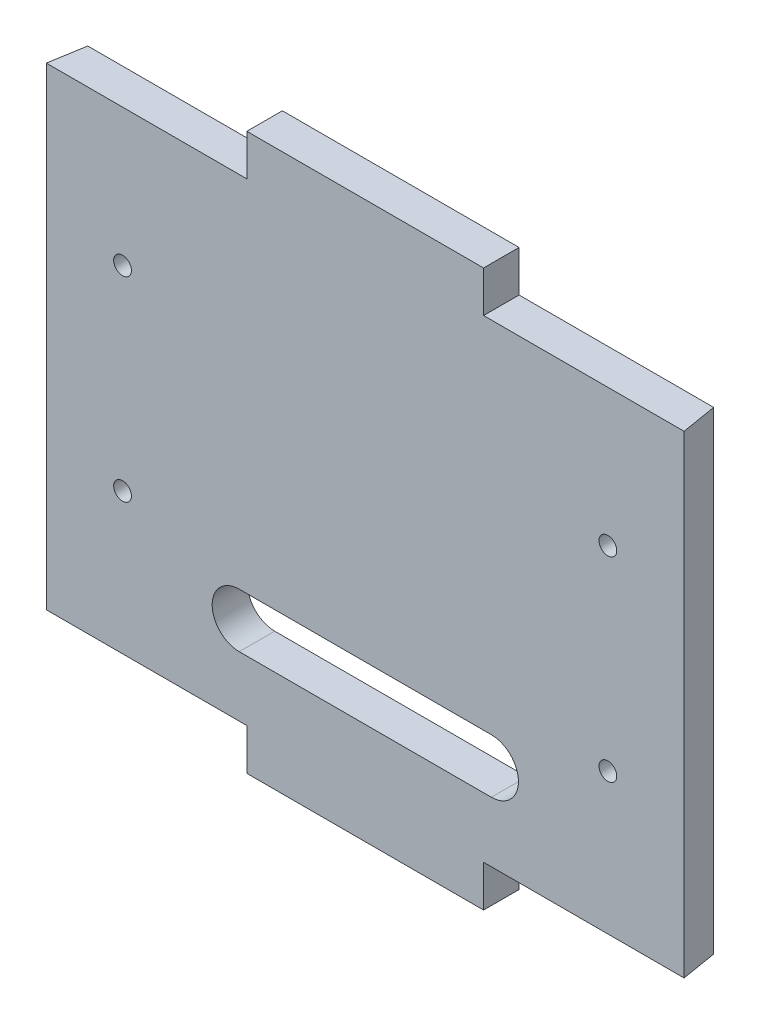
ISO-10303-21;
HEADER;
FILE_DESCRIPTION(('STEP AP214'),'2;1');
FILE_NAME('part.step','',(''),(''),'','','');
FILE_SCHEMA(('AUTOMOTIVE_DESIGN { 1 0 10303 214 1 1 1 1 }'));
ENDSEC;
DATA;
#1=APPLICATION_CONTEXT('core data for automotive mechanical design processes');
#2=APPLICATION_PROTOCOL_DEFINITION('international standard','automotive_design',2000,#1);
#3=PRODUCT_CONTEXT('',#1,'mechanical');
#4=PRODUCT('Part','Part','',(#3));
#5=PRODUCT_RELATED_PRODUCT_CATEGORY('part','',(#4));
#6=PRODUCT_DEFINITION_FORMATION('','',#4);
#7=PRODUCT_DEFINITION_CONTEXT('part definition',#1,'design');
#8=PRODUCT_DEFINITION('design','',#6,#7);
#9=PRODUCT_DEFINITION_SHAPE('','',#8);
#10=(LENGTH_UNIT() NAMED_UNIT(*) SI_UNIT(.MILLI.,.METRE.));
#11=(NAMED_UNIT(*) PLANE_ANGLE_UNIT() SI_UNIT($,.RADIAN.));
#12=(NAMED_UNIT(*) SI_UNIT($,.STERADIAN.) SOLID_ANGLE_UNIT());
#13=UNCERTAINTY_MEASURE_WITH_UNIT(LENGTH_MEASURE(1.E-05),#10,'distance_accuracy_value','');
#14=(GEOMETRIC_REPRESENTATION_CONTEXT(3) GLOBAL_UNCERTAINTY_ASSIGNED_CONTEXT((#13)) GLOBAL_UNIT_ASSIGNED_CONTEXT((#10,
#11,#12)) REPRESENTATION_CONTEXT('',''));
#15=CARTESIAN_POINT('',(0.,0.,0.));
#16=DIRECTION('',(0.,0.,1.));
#17=DIRECTION('',(1.,0.,0.));
#18=AXIS2_PLACEMENT_3D('',#15,#16,#17);
#19=CARTESIAN_POINT('',(33.2768883955837,10.8027095474567,3.));
#20=DIRECTION('',(0.,-1.,0.));
#21=DIRECTION('',(0.,0.,-1.));
#22=AXIS2_PLACEMENT_3D('',#19,#20,#21);
#23=PLANE('',#22);
#24=DIRECTION('',(-0.164398987305357,0.,0.986393923832144));
#25=VECTOR('',#24,1.);
#26=CARTESIAN_POINT('',(16.7948497787383,10.8027095474567,0.252993563859098));
#27=LINE('',#26,#25);
#28=CARTESIAN_POINT('',(16.8370153727148,10.8027095474567,0.));
#29=VERTEX_POINT('',#28);
#30=CARTESIAN_POINT('',(16.3370153727148,10.8027095474567,3.));
#31=VERTEX_POINT('',#30);
#32=EDGE_CURVE('E205',#29,#31,#27,.T.);
#33=ORIENTED_EDGE('',*,*,#32,.F.);
#34=DIRECTION('',(-1.,0.,0.));
#35=VECTOR('',#34,1.);
#36=CARTESIAN_POINT('',(33.2768883955837,10.8027095474567,0.));
#37=LINE('',#36,#35);
#38=CARTESIAN_POINT('',(33.2768883955837,10.8027095474567,0.));
#39=VERTEX_POINT('',#38);
#40=EDGE_CURVE('E247',#39,#29,#37,.T.);
#41=ORIENTED_EDGE('',*,*,#40,.F.);
#42=DIRECTION('',(0.,0.,-1.));
#43=VECTOR('',#42,1.);
#44=CARTESIAN_POINT('',(33.2768883955837,10.8027095474567,3.));
#45=LINE('',#44,#43);
#46=CARTESIAN_POINT('',(33.2768883955837,10.8027095474567,3.));
#47=VERTEX_POINT('',#46);
#48=EDGE_CURVE('E310',#47,#39,#45,.T.);
#49=ORIENTED_EDGE('',*,*,#48,.F.);
#50=DIRECTION('',(-1.,0.,0.));
#51=VECTOR('',#50,1.);
#52=CARTESIAN_POINT('',(33.2768883955837,10.8027095474567,3.));
#53=LINE('',#52,#51);
#54=EDGE_CURVE('E248',#47,#31,#53,.T.);
#55=ORIENTED_EDGE('',*,*,#54,.T.);
#56=EDGE_LOOP('',(#33,#41,#49,#55));
#57=FACE_BOUND('',#56,.T.);
#58=ADVANCED_FACE('F38',(#57),#23,.T.);
#59=CARTESIAN_POINT('',(33.2768883955837,10.8027095474567,3.));
#60=DIRECTION('',(1.,0.,0.));
#61=DIRECTION('',(0.,0.,-1.));
#62=AXIS2_PLACEMENT_3D('',#59,#60,#61);
#63=PLANE('',#62);
#64=DIRECTION('',(0.,-1.,0.));
#65=VECTOR('',#64,1.);
#66=CARTESIAN_POINT('',(33.2768883955837,10.8027095474567,0.));
#67=LINE('',#66,#65);
#68=CARTESIAN_POINT('',(33.2768883955837,7.30270954745676,0.));
#69=VERTEX_POINT('',#68);
#70=EDGE_CURVE('E253',#39,#69,#67,.T.);
#71=ORIENTED_EDGE('',*,*,#70,.T.);
#72=DIRECTION('',(0.,0.,-1.));
#73=VECTOR('',#72,1.);
#74=CARTESIAN_POINT('',(33.2768883955837,7.30270954745676,3.));
#75=LINE('',#74,#73);
#76=CARTESIAN_POINT('',(33.2768883955837,7.30270954745676,3.));
#77=VERTEX_POINT('',#76);
#78=EDGE_CURVE('E231',#77,#69,#75,.T.);
#79=ORIENTED_EDGE('',*,*,#78,.F.);
#80=DIRECTION('',(0.,-1.,0.));
#81=VECTOR('',#80,1.);
#82=CARTESIAN_POINT('',(33.2768883955837,10.8027095474567,3.));
#83=LINE('',#82,#81);
#84=EDGE_CURVE('E280',#47,#77,#83,.T.);
#85=ORIENTED_EDGE('',*,*,#84,.F.);
#86=ORIENTED_EDGE('',*,*,#48,.T.);
#87=EDGE_LOOP('',(#71,#79,#85,#86));
#88=FACE_BOUND('',#87,.T.);
#89=ADVANCED_FACE('F372',(#88),#63,.F.);
#90=CARTESIAN_POINT('',(53.2768883955837,9.30270954745676,3.));
#91=DIRECTION('',(-1.,0.,0.));
#92=DIRECTION('',(0.,-1.,0.));
#93=AXIS2_PLACEMENT_3D('',#90,#91,#92);
#94=PLANE('',#93);
#95=DIRECTION('',(0.,1.,0.));
#96=VECTOR('',#95,1.);
#97=CARTESIAN_POINT('',(53.2768883955837,9.30270954745676,0.));
#98=LINE('',#97,#96);
#99=CARTESIAN_POINT('',(53.2768883955837,7.30270954745676,0.));
#100=VERTEX_POINT('',#99);
#101=CARTESIAN_POINT('',(53.2768883955837,10.8027095474567,0.));
#102=VERTEX_POINT('',#101);
#103=EDGE_CURVE('E304',#100,#102,#98,.T.);
#104=ORIENTED_EDGE('',*,*,#103,.T.);
#105=DIRECTION('',(0.,0.,-1.));
#106=VECTOR('',#105,1.);
#107=CARTESIAN_POINT('',(53.2768883955837,10.8027095474567,3.));
#108=LINE('',#107,#106);
#109=CARTESIAN_POINT('',(53.2768883955837,10.8027095474567,3.));
#110=VERTEX_POINT('',#109);
#111=EDGE_CURVE('E314',#110,#102,#108,.T.);
#112=ORIENTED_EDGE('',*,*,#111,.F.);
#113=DIRECTION('',(0.,1.,0.));
#114=VECTOR('',#113,1.);
#115=CARTESIAN_POINT('',(53.2768883955837,9.30270954745676,3.));
#116=LINE('',#115,#114);
#117=CARTESIAN_POINT('',(53.2768883955837,7.30270954745676,3.));
#118=VERTEX_POINT('',#117);
#119=EDGE_CURVE('E277',#118,#110,#116,.T.);
#120=ORIENTED_EDGE('',*,*,#119,.F.);
#121=DIRECTION('',(0.,0.,1.));
#122=VECTOR('',#121,1.);
#123=CARTESIAN_POINT('',(53.2768883955837,7.30270954745676,0.));
#124=LINE('',#123,#122);
#125=EDGE_CURVE('E239',#100,#118,#124,.T.);
#126=ORIENTED_EDGE('',*,*,#125,.F.);
#127=EDGE_LOOP('',(#104,#112,#120,#126));
#128=FACE_BOUND('',#127,.T.);
#129=ADVANCED_FACE('F379',(#128),#94,.F.);
#130=CARTESIAN_POINT('',(70.2167614184526,10.8027095474567,3.));
#131=DIRECTION('',(0.,-1.,0.));
#132=DIRECTION('',(0.,0.,-1.));
#133=AXIS2_PLACEMENT_3D('',#130,#131,#132);
#134=PLANE('',#133);
#135=DIRECTION('',(-0.164398987305357,0.,-0.986393923832144));
#136=VECTOR('',#135,1.);
#137=CARTESIAN_POINT('',(70.2167614184526,10.8027095474567,3.));
#138=LINE('',#137,#136);
#139=CARTESIAN_POINT('',(70.2167614184526,10.8027095474567,3.));
#140=VERTEX_POINT('',#139);
#141=CARTESIAN_POINT('',(69.7167614184526,10.8027095474567,0.));
#142=VERTEX_POINT('',#141);
#143=EDGE_CURVE('E212',#140,#142,#138,.T.);
#144=ORIENTED_EDGE('',*,*,#143,.F.);
#145=DIRECTION('',(-1.,0.,0.));
#146=VECTOR('',#145,1.);
#147=CARTESIAN_POINT('',(70.2167614184526,10.8027095474567,3.));
#148=LINE('',#147,#146);
#149=EDGE_CURVE('E273',#140,#110,#148,.T.);
#150=ORIENTED_EDGE('',*,*,#149,.T.);
#151=ORIENTED_EDGE('',*,*,#111,.T.);
#152=DIRECTION('',(-1.,0.,0.));
#153=VECTOR('',#152,1.);
#154=CARTESIAN_POINT('',(70.2167614184526,10.8027095474567,0.));
#155=LINE('',#154,#153);
#156=EDGE_CURVE('E301',#142,#102,#155,.T.);
#157=ORIENTED_EDGE('',*,*,#156,.F.);
#158=EDGE_LOOP('',(#144,#150,#151,#157));
#159=FACE_BOUND('',#158,.T.);
#160=ADVANCED_FACE('F427',(#159),#134,.T.);
#161=CARTESIAN_POINT('',(70.2167614184526,50.8027095474567,3.));
#162=DIRECTION('',(0.,-1.,0.));
#163=DIRECTION('',(0.,0.,-1.));
#164=AXIS2_PLACEMENT_3D('',#161,#162,#163);
#165=PLANE('',#164);
#166=DIRECTION('',(-1.,0.,0.));
#167=VECTOR('',#166,1.);
#168=CARTESIAN_POINT('',(70.2167614184526,50.8027095474567,3.));
#169=LINE('',#168,#167);
#170=CARTESIAN_POINT('',(70.2167614184526,50.8027095474567,3.));
#171=VERTEX_POINT('',#170);
#172=CARTESIAN_POINT('',(53.2768883955837,50.8027095474567,3.));
#173=VERTEX_POINT('',#172);
#174=EDGE_CURVE('E267',#171,#173,#169,.T.);
#175=ORIENTED_EDGE('',*,*,#174,.F.);
#176=DIRECTION('',(0.164398987305357,0.,0.986393923832144));
#177=VECTOR('',#176,1.);
#178=CARTESIAN_POINT('',(69.7167614184526,50.8027095474567,0.));
#179=LINE('',#178,#177);
#180=CARTESIAN_POINT('',(69.7167614184526,50.8027095474567,0.));
#181=VERTEX_POINT('',#180);
#182=EDGE_CURVE('E202',#181,#171,#179,.T.);
#183=ORIENTED_EDGE('',*,*,#182,.F.);
#184=DIRECTION('',(-1.,0.,0.));
#185=VECTOR('',#184,1.);
#186=CARTESIAN_POINT('',(70.2167614184526,50.8027095474567,0.));
#187=LINE('',#186,#185);
#188=CARTESIAN_POINT('',(53.2768883955837,50.8027095474567,0.));
#189=VERTEX_POINT('',#188);
#190=EDGE_CURVE('E298',#181,#189,#187,.T.);
#191=ORIENTED_EDGE('',*,*,#190,.T.);
#192=DIRECTION('',(0.,0.,-1.));
#193=VECTOR('',#192,1.);
#194=CARTESIAN_POINT('',(53.2768883955837,50.8027095474567,3.));
#195=LINE('',#194,#193);
#196=EDGE_CURVE('E318',#173,#189,#195,.T.);
#197=ORIENTED_EDGE('',*,*,#196,.F.);
#198=EDGE_LOOP('',(#175,#183,#191,#197));
#199=FACE_BOUND('',#198,.T.);
#200=ADVANCED_FACE('F421',(#199),#165,.F.);
#201=CARTESIAN_POINT('',(53.2768883955837,52.2831275554296,3.));
#202=DIRECTION('',(1.,0.,0.));
#203=DIRECTION('',(0.,0.,-1.));
#204=AXIS2_PLACEMENT_3D('',#201,#202,#203);
#205=PLANE('',#204);
#206=DIRECTION('',(0.,-1.,0.));
#207=VECTOR('',#206,1.);
#208=CARTESIAN_POINT('',(53.2768883955837,52.2831275554296,0.));
#209=LINE('',#208,#207);
#210=CARTESIAN_POINT('',(53.2768883955837,54.2831275554296,0.));
#211=VERTEX_POINT('',#210);
#212=EDGE_CURVE('E294',#211,#189,#209,.T.);
#213=ORIENTED_EDGE('',*,*,#212,.F.);
#214=DIRECTION('',(0.,0.,-1.));
#215=VECTOR('',#214,1.);
#216=CARTESIAN_POINT('',(53.2768883955837,54.2831275554296,3.));
#217=LINE('',#216,#215);
#218=CARTESIAN_POINT('',(53.2768883955837,54.2831275554296,3.));
#219=VERTEX_POINT('',#218);
#220=EDGE_CURVE('E215',#219,#211,#217,.T.);
#221=ORIENTED_EDGE('',*,*,#220,.F.);
#222=DIRECTION('',(0.,-1.,0.));
#223=VECTOR('',#222,1.);
#224=CARTESIAN_POINT('',(53.2768883955837,52.2831275554296,3.));
#225=LINE('',#224,#223);
#226=EDGE_CURVE('E263',#219,#173,#225,.T.);
#227=ORIENTED_EDGE('',*,*,#226,.T.);
#228=ORIENTED_EDGE('',*,*,#196,.T.);
#229=EDGE_LOOP('',(#213,#221,#227,#228));
#230=FACE_BOUND('',#229,.T.);
#231=ADVANCED_FACE('F416',(#230),#205,.T.);
#232=CARTESIAN_POINT('',(33.2768883955837,50.8027095474567,3.));
#233=DIRECTION('',(-1.,0.,0.));
#234=DIRECTION('',(0.,0.,1.));
#235=AXIS2_PLACEMENT_3D('',#232,#233,#234);
#236=PLANE('',#235);
#237=DIRECTION('',(0.,1.,0.));
#238=VECTOR('',#237,1.);
#239=CARTESIAN_POINT('',(33.2768883955837,50.8027095474567,0.));
#240=LINE('',#239,#238);
#241=CARTESIAN_POINT('',(33.2768883955837,50.8027095474567,0.));
#242=VERTEX_POINT('',#241);
#243=CARTESIAN_POINT('',(33.2768883955837,54.2831275554296,0.));
#244=VERTEX_POINT('',#243);
#245=EDGE_CURVE('E291',#242,#244,#240,.T.);
#246=ORIENTED_EDGE('',*,*,#245,.F.);
#247=DIRECTION('',(0.,0.,-1.));
#248=VECTOR('',#247,1.);
#249=CARTESIAN_POINT('',(33.2768883955837,50.8027095474567,3.));
#250=LINE('',#249,#248);
#251=CARTESIAN_POINT('',(33.2768883955837,50.8027095474567,3.));
#252=VERTEX_POINT('',#251);
#253=EDGE_CURVE('E283',#252,#242,#250,.T.);
#254=ORIENTED_EDGE('',*,*,#253,.F.);
#255=DIRECTION('',(0.,1.,0.));
#256=VECTOR('',#255,1.);
#257=CARTESIAN_POINT('',(33.2768883955837,50.8027095474567,3.));
#258=LINE('',#257,#256);
#259=CARTESIAN_POINT('',(33.2768883955837,54.2831275554296,3.));
#260=VERTEX_POINT('',#259);
#261=EDGE_CURVE('E260',#252,#260,#258,.T.);
#262=ORIENTED_EDGE('',*,*,#261,.T.);
#263=DIRECTION('',(0.,0.,1.));
#264=VECTOR('',#263,1.);
#265=CARTESIAN_POINT('',(33.2768883955837,54.2831275554296,0.));
#266=LINE('',#265,#264);
#267=EDGE_CURVE('E223',#244,#260,#266,.T.);
#268=ORIENTED_EDGE('',*,*,#267,.F.);
#269=EDGE_LOOP('',(#246,#254,#262,#268));
#270=FACE_BOUND('',#269,.T.);
#271=ADVANCED_FACE('F407',(#270),#236,.T.);
#272=CARTESIAN_POINT('',(33.2768883955837,50.8027095474567,3.));
#273=DIRECTION('',(0.,-1.,0.));
#274=DIRECTION('',(0.,0.,-1.));
#275=AXIS2_PLACEMENT_3D('',#272,#273,#274);
#276=PLANE('',#275);
#277=DIRECTION('',(-1.,0.,0.));
#278=VECTOR('',#277,1.);
#279=CARTESIAN_POINT('',(33.2768883955837,50.8027095474567,0.));
#280=LINE('',#279,#278);
#281=CARTESIAN_POINT('',(16.8370153727148,50.8027095474567,0.));
#282=VERTEX_POINT('',#281);
#283=EDGE_CURVE('E287',#242,#282,#280,.T.);
#284=ORIENTED_EDGE('',*,*,#283,.T.);
#285=DIRECTION('',(0.164398987305357,0.,-0.986393923832144));
#286=VECTOR('',#285,1.);
#287=CARTESIAN_POINT('',(16.8370153727148,50.8027095474567,0.));
#288=LINE('',#287,#286);
#289=CARTESIAN_POINT('',(16.3370153727148,50.8027095474567,3.));
#290=VERTEX_POINT('',#289);
#291=EDGE_CURVE('E206',#290,#282,#288,.T.);
#292=ORIENTED_EDGE('',*,*,#291,.F.);
#293=DIRECTION('',(-1.,0.,0.));
#294=VECTOR('',#293,1.);
#295=CARTESIAN_POINT('',(33.2768883955837,50.8027095474567,3.));
#296=LINE('',#295,#294);
#297=EDGE_CURVE('E256',#252,#290,#296,.T.);
#298=ORIENTED_EDGE('',*,*,#297,.F.);
#299=ORIENTED_EDGE('',*,*,#253,.T.);
#300=EDGE_LOOP('',(#284,#292,#298,#299));
#301=FACE_BOUND('',#300,.T.);
#302=ADVANCED_FACE('F402',(#301),#276,.F.);
#303=CARTESIAN_POINT('',(0.,0.,3.));
#304=DIRECTION('',(0.,0.,-1.));
#305=DIRECTION('',(-1.,0.,0.));
#306=AXIS2_PLACEMENT_3D('',#303,#304,#305);
#307=PLANE('',#306);
#308=DIRECTION('',(1.,0.,0.));
#309=VECTOR('',#308,1.);
#310=CARTESIAN_POINT('',(32.6334116349469,15.8859988018158,3.));
#311=LINE('',#310,#309);
#312=CARTESIAN_POINT('',(32.6334116349469,15.8859988018158,3.));
#313=VERTEX_POINT('',#312);
#314=CARTESIAN_POINT('',(53.9358074414597,15.8859988018158,3.));
#315=VERTEX_POINT('',#314);
#316=EDGE_CURVE('E163',#313,#315,#311,.T.);
#317=ORIENTED_EDGE('',*,*,#316,.F.);
#318=CARTESIAN_POINT('',(32.6334116349469,18.1729396264475,3.));
#319=DIRECTION('',(0.,0.,1.));
#320=DIRECTION('',(1.,0.,0.));
#321=AXIS2_PLACEMENT_3D('',#318,#319,#320);
#322=CIRCLE('',#321,2.28694082463163);
#323=CARTESIAN_POINT('',(32.6334116349469,20.4598804510791,3.));
#324=VERTEX_POINT('',#323);
#325=EDGE_CURVE('E53',#324,#313,#322,.T.);
#326=ORIENTED_EDGE('',*,*,#325,.F.);
#327=DIRECTION('',(-1.,0.,0.));
#328=VECTOR('',#327,1.);
#329=CARTESIAN_POINT('',(32.6334116349469,20.4598804510791,3.));
#330=LINE('',#329,#328);
#331=CARTESIAN_POINT('',(53.9358074414597,20.4598804510791,3.));
#332=VERTEX_POINT('',#331);
#333=EDGE_CURVE('E171',#332,#324,#330,.T.);
#334=ORIENTED_EDGE('',*,*,#333,.F.);
#335=CARTESIAN_POINT('',(53.9358074414597,18.1729396264475,3.));
#336=DIRECTION('',(0.,0.,1.));
#337=DIRECTION('',(1.,0.,0.));
#338=AXIS2_PLACEMENT_3D('',#335,#336,#337);
#339=CIRCLE('',#338,2.28694082463163);
#340=EDGE_CURVE('E153',#315,#332,#339,.T.);
#341=ORIENTED_EDGE('',*,*,#340,.F.);
#342=EDGE_LOOP('',(#317,#326,#334,#341));
#343=FACE_BOUND('',#342,.T.);
#344=CARTESIAN_POINT('',(63.7768883955837,39.2186226045867,3.));
#345=DIRECTION('',(0.,0.,1.));
#346=DIRECTION('',(-1.,0.,0.));
#347=AXIS2_PLACEMENT_3D('',#344,#345,#346);
#348=CIRCLE('',#347,0.749999999999999);
#349=CARTESIAN_POINT('',(63.0268883955837,39.2186226045867,3.));
#350=VERTEX_POINT('',#349);
#351=EDGE_CURVE('E181',#350,#350,#348,.T.);
#352=ORIENTED_EDGE('',*,*,#351,.F.);
#353=EDGE_LOOP('',(#352));
#354=FACE_BOUND('',#353,.T.);
#355=CARTESIAN_POINT('',(63.7768883955837,22.7186226045867,3.));
#356=DIRECTION('',(0.,0.,1.));
#357=DIRECTION('',(-1.,0.,0.));
#358=AXIS2_PLACEMENT_3D('',#355,#356,#357);
#359=CIRCLE('',#358,0.749999999999999);
#360=CARTESIAN_POINT('',(63.0268883955837,22.7186226045867,3.));
#361=VERTEX_POINT('',#360);
#362=EDGE_CURVE('E191',#361,#361,#359,.T.);
#363=ORIENTED_EDGE('',*,*,#362,.F.);
#364=EDGE_LOOP('',(#363));
#365=FACE_BOUND('',#364,.T.);
#366=CARTESIAN_POINT('',(22.7768883955837,22.7186226045867,3.));
#367=DIRECTION('',(0.,0.,1.));
#368=DIRECTION('',(1.,0.,0.));
#369=AXIS2_PLACEMENT_3D('',#366,#367,#368);
#370=CIRCLE('',#369,0.750000000000002);
#371=CARTESIAN_POINT('',(23.5268883955837,22.7186226045867,3.));
#372=VERTEX_POINT('',#371);
#373=EDGE_CURVE('E186',#372,#372,#370,.T.);
#374=ORIENTED_EDGE('',*,*,#373,.F.);
#375=EDGE_LOOP('',(#374));
#376=FACE_BOUND('',#375,.T.);
#377=CARTESIAN_POINT('',(22.7768883955837,39.2186226045867,3.));
#378=DIRECTION('',(0.,0.,1.));
#379=DIRECTION('',(1.,0.,0.));
#380=AXIS2_PLACEMENT_3D('',#377,#378,#379);
#381=CIRCLE('',#380,0.750000000000002);
#382=CARTESIAN_POINT('',(23.5268883955837,39.2186226045867,3.));
#383=VERTEX_POINT('',#382);
#384=EDGE_CURVE('E190',#383,#383,#381,.T.);
#385=ORIENTED_EDGE('',*,*,#384,.F.);
#386=EDGE_LOOP('',(#385));
#387=FACE_BOUND('',#386,.T.);
#388=ORIENTED_EDGE('',*,*,#54,.F.);
#389=ORIENTED_EDGE('',*,*,#84,.T.);
#390=DIRECTION('',(-1.,0.,0.));
#391=VECTOR('',#390,1.);
#392=CARTESIAN_POINT('',(53.2768883955837,7.30270954745676,3.));
#393=LINE('',#392,#391);
#394=EDGE_CURVE('E243',#118,#77,#393,.T.);
#395=ORIENTED_EDGE('',*,*,#394,.F.);
#396=ORIENTED_EDGE('',*,*,#119,.T.);
#397=ORIENTED_EDGE('',*,*,#149,.F.);
#398=DIRECTION('',(0.,-1.,0.));
#399=VECTOR('',#398,1.);
#400=CARTESIAN_POINT('',(70.2167614184526,50.8027095474567,3.));
#401=LINE('',#400,#399);
#402=EDGE_CURVE('E270',#171,#140,#401,.T.);
#403=ORIENTED_EDGE('',*,*,#402,.F.);
#404=ORIENTED_EDGE('',*,*,#174,.T.);
#405=ORIENTED_EDGE('',*,*,#226,.F.);
#406=DIRECTION('',(1.,0.,0.));
#407=VECTOR('',#406,1.);
#408=CARTESIAN_POINT('',(33.2768883955837,54.2831275554296,3.));
#409=LINE('',#408,#407);
#410=EDGE_CURVE('E227',#260,#219,#409,.T.);
#411=ORIENTED_EDGE('',*,*,#410,.F.);
#412=ORIENTED_EDGE('',*,*,#261,.F.);
#413=ORIENTED_EDGE('',*,*,#297,.T.);
#414=DIRECTION('',(0.,1.,0.));
#415=VECTOR('',#414,1.);
#416=CARTESIAN_POINT('',(16.3370153727149,10.8027095474567,3.));
#417=LINE('',#416,#415);
#418=EDGE_CURVE('E252',#31,#290,#417,.T.);
#419=ORIENTED_EDGE('',*,*,#418,.F.);
#420=EDGE_LOOP('',(#388,#389,#395,#396,#397,#403,#404,#405,#411,#412,#413,#419));
#421=FACE_BOUND('',#420,.T.);
#422=ADVANCED_FACE('F168',(#343,#354,#365,#376,#387,#421),#307,.F.);
#423=CARTESIAN_POINT('',(0.,0.,0.));
#424=DIRECTION('',(0.,0.,-1.));
#425=DIRECTION('',(-1.,0.,0.));
#426=AXIS2_PLACEMENT_3D('',#423,#424,#425);
#427=PLANE('',#426);
#428=CARTESIAN_POINT('',(32.6334116349469,18.1729396264475,0.));
#429=DIRECTION('',(0.,0.,-1.));
#430=DIRECTION('',(-1.,0.,0.));
#431=AXIS2_PLACEMENT_3D('',#428,#429,#430);
#432=CIRCLE('',#431,2.28694082463163);
#433=CARTESIAN_POINT('',(32.6334116349469,15.8859988018158,0.));
#434=VERTEX_POINT('',#433);
#435=CARTESIAN_POINT('',(32.6334116349469,20.4598804510791,0.));
#436=VERTEX_POINT('',#435);
#437=EDGE_CURVE('E11',#434,#436,#432,.T.);
#438=ORIENTED_EDGE('',*,*,#437,.F.);
#439=DIRECTION('',(-1.,0.,0.));
#440=VECTOR('',#439,1.);
#441=CARTESIAN_POINT('',(0.,15.8859988018158,0.));
#442=LINE('',#441,#440);
#443=CARTESIAN_POINT('',(53.9358074414597,15.8859988018158,0.));
#444=VERTEX_POINT('',#443);
#445=EDGE_CURVE('E329',#444,#434,#442,.T.);
#446=ORIENTED_EDGE('',*,*,#445,.F.);
#447=CARTESIAN_POINT('',(53.9358074414597,18.1729396264475,0.));
#448=DIRECTION('',(0.,0.,-1.));
#449=DIRECTION('',(-1.,0.,0.));
#450=AXIS2_PLACEMENT_3D('',#447,#448,#449);
#451=CIRCLE('',#450,2.28694082463163);
#452=CARTESIAN_POINT('',(53.9358074414597,20.4598804510791,0.));
#453=VERTEX_POINT('',#452);
#454=EDGE_CURVE('E156',#453,#444,#451,.T.);
#455=ORIENTED_EDGE('',*,*,#454,.F.);
#456=DIRECTION('',(1.,0.,0.));
#457=VECTOR('',#456,1.);
#458=CARTESIAN_POINT('',(0.,20.4598804510791,0.));
#459=LINE('',#458,#457);
#460=EDGE_CURVE('E46',#436,#453,#459,.T.);
#461=ORIENTED_EDGE('',*,*,#460,.F.);
#462=EDGE_LOOP('',(#438,#446,#455,#461));
#463=FACE_BOUND('',#462,.T.);
#464=CARTESIAN_POINT('',(63.7768883955837,39.2186226045867,0.));
#465=DIRECTION('',(0.,0.,-1.));
#466=DIRECTION('',(-1.,0.,0.));
#467=AXIS2_PLACEMENT_3D('',#464,#465,#466);
#468=CIRCLE('',#467,0.749999999999999);
#469=CARTESIAN_POINT('',(63.0268883955837,39.2186226045867,0.));
#470=VERTEX_POINT('',#469);
#471=EDGE_CURVE('E209',#470,#470,#468,.T.);
#472=ORIENTED_EDGE('',*,*,#471,.F.);
#473=EDGE_LOOP('',(#472));
#474=FACE_BOUND('',#473,.T.);
#475=CARTESIAN_POINT('',(63.7768883955837,22.7186226045867,0.));
#476=DIRECTION('',(0.,0.,-1.));
#477=DIRECTION('',(-1.,0.,0.));
#478=AXIS2_PLACEMENT_3D('',#475,#476,#477);
#479=CIRCLE('',#478,0.749999999999999);
#480=CARTESIAN_POINT('',(63.0268883955837,22.7186226045867,0.));
#481=VERTEX_POINT('',#480);
#482=EDGE_CURVE('E337',#481,#481,#479,.T.);
#483=ORIENTED_EDGE('',*,*,#482,.F.);
#484=EDGE_LOOP('',(#483));
#485=FACE_BOUND('',#484,.T.);
#486=CARTESIAN_POINT('',(22.7768883955837,22.7186226045867,0.));
#487=DIRECTION('',(0.,0.,-1.));
#488=DIRECTION('',(-1.,0.,0.));
#489=AXIS2_PLACEMENT_3D('',#486,#487,#488);
#490=CIRCLE('',#489,0.750000000000002);
#491=CARTESIAN_POINT('',(22.0268883955837,22.7186226045867,0.));
#492=VERTEX_POINT('',#491);
#493=EDGE_CURVE('E333',#492,#492,#490,.T.);
#494=ORIENTED_EDGE('',*,*,#493,.F.);
#495=EDGE_LOOP('',(#494));
#496=FACE_BOUND('',#495,.T.);
#497=CARTESIAN_POINT('',(22.7768883955837,39.2186226045867,0.));
#498=DIRECTION('',(0.,0.,-1.));
#499=DIRECTION('',(-1.,0.,0.));
#500=AXIS2_PLACEMENT_3D('',#497,#498,#499);
#501=CIRCLE('',#500,0.750000000000002);
#502=CARTESIAN_POINT('',(22.0268883955837,39.2186226045867,0.));
#503=VERTEX_POINT('',#502);
#504=EDGE_CURVE('E201',#503,#503,#501,.T.);
#505=ORIENTED_EDGE('',*,*,#504,.F.);
#506=EDGE_LOOP('',(#505));
#507=FACE_BOUND('',#506,.T.);
#508=DIRECTION('',(0.,1.,0.));
#509=VECTOR('',#508,1.);
#510=CARTESIAN_POINT('',(69.7167614184526,0.,0.));
#511=LINE('',#510,#509);
#512=EDGE_CURVE('E326',#142,#181,#511,.T.);
#513=ORIENTED_EDGE('',*,*,#512,.F.);
#514=ORIENTED_EDGE('',*,*,#156,.T.);
#515=ORIENTED_EDGE('',*,*,#103,.F.);
#516=DIRECTION('',(1.,0.,0.));
#517=VECTOR('',#516,1.);
#518=CARTESIAN_POINT('',(33.2768883955837,7.30270954745676,0.));
#519=LINE('',#518,#517);
#520=EDGE_CURVE('E235',#69,#100,#519,.T.);
#521=ORIENTED_EDGE('',*,*,#520,.F.);
#522=ORIENTED_EDGE('',*,*,#70,.F.);
#523=ORIENTED_EDGE('',*,*,#40,.T.);
#524=DIRECTION('',(0.,-1.,0.));
#525=VECTOR('',#524,1.);
#526=CARTESIAN_POINT('',(16.8370153727148,0.,0.));
#527=LINE('',#526,#525);
#528=EDGE_CURVE('E313',#282,#29,#527,.T.);
#529=ORIENTED_EDGE('',*,*,#528,.F.);
#530=ORIENTED_EDGE('',*,*,#283,.F.);
#531=ORIENTED_EDGE('',*,*,#245,.T.);
#532=DIRECTION('',(-1.,0.,0.));
#533=VECTOR('',#532,1.);
#534=CARTESIAN_POINT('',(53.2768883955837,54.2831275554296,0.));
#535=LINE('',#534,#533);
#536=EDGE_CURVE('E219',#211,#244,#535,.T.);
#537=ORIENTED_EDGE('',*,*,#536,.F.);
#538=ORIENTED_EDGE('',*,*,#212,.T.);
#539=ORIENTED_EDGE('',*,*,#190,.F.);
#540=EDGE_LOOP('',(#513,#514,#515,#521,#522,#523,#529,#530,#531,#537,#538,#539));
#541=FACE_BOUND('',#540,.T.);
#542=ADVANCED_FACE('F354',(#463,#474,#485,#496,#507,#541),#427,.T.);
#543=CARTESIAN_POINT('',(0.,7.30270954745676,0.));
#544=DIRECTION('',(0.,-1.,0.));
#545=DIRECTION('',(0.,0.,-1.));
#546=AXIS2_PLACEMENT_3D('',#543,#544,#545);
#547=PLANE('',#546);
#548=ORIENTED_EDGE('',*,*,#78,.T.);
#549=ORIENTED_EDGE('',*,*,#520,.T.);
#550=ORIENTED_EDGE('',*,*,#125,.T.);
#551=ORIENTED_EDGE('',*,*,#394,.T.);
#552=EDGE_LOOP('',(#548,#549,#550,#551));
#553=FACE_BOUND('',#552,.T.);
#554=ADVANCED_FACE('F432',(#553),#547,.T.);
#555=CARTESIAN_POINT('',(0.,54.2831275554296,0.));
#556=DIRECTION('',(0.,1.,0.));
#557=DIRECTION('',(0.,0.,1.));
#558=AXIS2_PLACEMENT_3D('',#555,#556,#557);
#559=PLANE('',#558);
#560=ORIENTED_EDGE('',*,*,#220,.T.);
#561=ORIENTED_EDGE('',*,*,#536,.T.);
#562=ORIENTED_EDGE('',*,*,#267,.T.);
#563=ORIENTED_EDGE('',*,*,#410,.T.);
#564=EDGE_LOOP('',(#560,#561,#562,#563));
#565=FACE_BOUND('',#564,.T.);
#566=ADVANCED_FACE('F410',(#565),#559,.T.);
#567=CARTESIAN_POINT('',(16.8370153727148,6.80270954745672,0.));
#568=DIRECTION('',(0.986393923832144,0.,0.164398987305357));
#569=DIRECTION('',(0.164398987305357,0.,-0.986393923832144));
#570=AXIS2_PLACEMENT_3D('',#567,#568,#569);
#571=PLANE('',#570);
#572=ORIENTED_EDGE('',*,*,#32,.T.);
#573=ORIENTED_EDGE('',*,*,#418,.T.);
#574=ORIENTED_EDGE('',*,*,#291,.T.);
#575=ORIENTED_EDGE('',*,*,#528,.T.);
#576=EDGE_LOOP('',(#572,#573,#574,#575));
#577=FACE_BOUND('',#576,.T.);
#578=ADVANCED_FACE('F400',(#577),#571,.F.);
#579=CARTESIAN_POINT('',(69.7167614184526,6.80270954745672,0.));
#580=DIRECTION('',(-0.986393923832144,0.,0.164398987305357));
#581=DIRECTION('',(0.164398987305357,0.,0.986393923832144));
#582=AXIS2_PLACEMENT_3D('',#579,#580,#581);
#583=PLANE('',#582);
#584=ORIENTED_EDGE('',*,*,#143,.T.);
#585=ORIENTED_EDGE('',*,*,#512,.T.);
#586=ORIENTED_EDGE('',*,*,#182,.T.);
#587=ORIENTED_EDGE('',*,*,#402,.T.);
#588=EDGE_LOOP('',(#584,#585,#586,#587));
#589=FACE_BOUND('',#588,.T.);
#590=ADVANCED_FACE('F423',(#589),#583,.F.);
#591=CARTESIAN_POINT('',(22.7768883955837,39.2186226045867,-13.));
#592=DIRECTION('',(0.,0.,1.));
#593=DIRECTION('',(1.,0.,0.));
#594=AXIS2_PLACEMENT_3D('',#591,#592,#593);
#595=CYLINDRICAL_SURFACE('',#594,0.750000000000002);
#596=ORIENTED_EDGE('',*,*,#504,.T.);
#597=EDGE_LOOP('',(#596));
#598=FACE_BOUND('',#597,.T.);
#599=ORIENTED_EDGE('',*,*,#384,.T.);
#600=EDGE_LOOP('',(#599));
#601=FACE_BOUND('',#600,.T.);
#602=ADVANCED_FACE('F473',(#598,#601),#595,.F.);
#603=CARTESIAN_POINT('',(22.7768883955837,22.7186226045867,-13.));
#604=DIRECTION('',(0.,0.,1.));
#605=DIRECTION('',(1.,0.,0.));
#606=AXIS2_PLACEMENT_3D('',#603,#604,#605);
#607=CYLINDRICAL_SURFACE('',#606,0.750000000000002);
#608=ORIENTED_EDGE('',*,*,#493,.T.);
#609=EDGE_LOOP('',(#608));
#610=FACE_BOUND('',#609,.T.);
#611=ORIENTED_EDGE('',*,*,#373,.T.);
#612=EDGE_LOOP('',(#611));
#613=FACE_BOUND('',#612,.T.);
#614=ADVANCED_FACE('F482',(#610,#613),#607,.F.);
#615=CARTESIAN_POINT('',(63.7768883955837,22.7186226045867,-13.));
#616=DIRECTION('',(0.,0.,1.));
#617=DIRECTION('',(1.,0.,0.));
#618=AXIS2_PLACEMENT_3D('',#615,#616,#617);
#619=CYLINDRICAL_SURFACE('',#618,0.749999999999999);
#620=ORIENTED_EDGE('',*,*,#482,.T.);
#621=EDGE_LOOP('',(#620));
#622=FACE_BOUND('',#621,.T.);
#623=ORIENTED_EDGE('',*,*,#362,.T.);
#624=EDGE_LOOP('',(#623));
#625=FACE_BOUND('',#624,.T.);
#626=ADVANCED_FACE('F366',(#622,#625),#619,.F.);
#627=CARTESIAN_POINT('',(63.7768883955837,39.2186226045867,-13.));
#628=DIRECTION('',(0.,0.,1.));
#629=DIRECTION('',(1.,0.,0.));
#630=AXIS2_PLACEMENT_3D('',#627,#628,#629);
#631=CYLINDRICAL_SURFACE('',#630,0.749999999999999);
#632=ORIENTED_EDGE('',*,*,#471,.T.);
#633=EDGE_LOOP('',(#632));
#634=FACE_BOUND('',#633,.T.);
#635=ORIENTED_EDGE('',*,*,#351,.T.);
#636=EDGE_LOOP('',(#635));
#637=FACE_BOUND('',#636,.T.);
#638=ADVANCED_FACE('F359',(#634,#637),#631,.F.);
#639=CARTESIAN_POINT('',(32.6334116349469,18.1729396264475,-13.));
#640=DIRECTION('',(0.,0.,1.));
#641=DIRECTION('',(1.,0.,0.));
#642=AXIS2_PLACEMENT_3D('',#639,#640,#641);
#643=CYLINDRICAL_SURFACE('',#642,2.28694082463163);
#644=ORIENTED_EDGE('',*,*,#437,.T.);
#645=DIRECTION('',(0.,0.,1.));
#646=VECTOR('',#645,1.);
#647=CARTESIAN_POINT('',(32.6334116349469,20.4598804510791,-13.));
#648=LINE('',#647,#646);
#649=EDGE_CURVE('E178',#436,#324,#648,.T.);
#650=ORIENTED_EDGE('',*,*,#649,.T.);
#651=ORIENTED_EDGE('',*,*,#325,.T.);
#652=DIRECTION('',(0.,0.,1.));
#653=VECTOR('',#652,1.);
#654=CARTESIAN_POINT('',(32.6334116349469,15.8859988018158,-13.));
#655=LINE('',#654,#653);
#656=EDGE_CURVE('E160',#434,#313,#655,.T.);
#657=ORIENTED_EDGE('',*,*,#656,.F.);
#658=EDGE_LOOP('',(#644,#650,#651,#657));
#659=FACE_BOUND('',#658,.T.);
#660=ADVANCED_FACE('F356',(#659),#643,.F.);
#661=CARTESIAN_POINT('',(32.6334116349469,20.4598804510791,-13.));
#662=DIRECTION('',(0.,1.,0.));
#663=DIRECTION('',(0.,0.,1.));
#664=AXIS2_PLACEMENT_3D('',#661,#662,#663);
#665=PLANE('',#664);
#666=ORIENTED_EDGE('',*,*,#460,.T.);
#667=DIRECTION('',(0.,0.,1.));
#668=VECTOR('',#667,1.);
#669=CARTESIAN_POINT('',(53.9358074414597,20.4598804510791,-13.));
#670=LINE('',#669,#668);
#671=EDGE_CURVE('E159',#453,#332,#670,.T.);
#672=ORIENTED_EDGE('',*,*,#671,.T.);
#673=ORIENTED_EDGE('',*,*,#333,.T.);
#674=ORIENTED_EDGE('',*,*,#649,.F.);
#675=EDGE_LOOP('',(#666,#672,#673,#674));
#676=FACE_BOUND('',#675,.T.);
#677=ADVANCED_FACE('F351',(#676),#665,.F.);
#678=CARTESIAN_POINT('',(53.9358074414597,18.1729396264475,-13.));
#679=DIRECTION('',(0.,0.,1.));
#680=DIRECTION('',(1.,0.,0.));
#681=AXIS2_PLACEMENT_3D('',#678,#679,#680);
#682=CYLINDRICAL_SURFACE('',#681,2.28694082463163);
#683=ORIENTED_EDGE('',*,*,#454,.T.);
#684=DIRECTION('',(0.,0.,1.));
#685=VECTOR('',#684,1.);
#686=CARTESIAN_POINT('',(53.9358074414597,15.8859988018158,-13.));
#687=LINE('',#686,#685);
#688=EDGE_CURVE('E61',#444,#315,#687,.T.);
#689=ORIENTED_EDGE('',*,*,#688,.T.);
#690=ORIENTED_EDGE('',*,*,#340,.T.);
#691=ORIENTED_EDGE('',*,*,#671,.F.);
#692=EDGE_LOOP('',(#683,#689,#690,#691));
#693=FACE_BOUND('',#692,.T.);
#694=ADVANCED_FACE('F150',(#693),#682,.F.);
#695=CARTESIAN_POINT('',(32.6334116349469,15.8859988018158,-13.));
#696=DIRECTION('',(0.,-1.,0.));
#697=DIRECTION('',(0.,0.,-1.));
#698=AXIS2_PLACEMENT_3D('',#695,#696,#697);
#699=PLANE('',#698);
#700=ORIENTED_EDGE('',*,*,#445,.T.);
#701=ORIENTED_EDGE('',*,*,#656,.T.);
#702=ORIENTED_EDGE('',*,*,#316,.T.);
#703=ORIENTED_EDGE('',*,*,#688,.F.);
#704=EDGE_LOOP('',(#700,#701,#702,#703));
#705=FACE_BOUND('',#704,.T.);
#706=ADVANCED_FACE('F164',(#705),#699,.F.);
#707=CLOSED_SHELL('',(#58,#89,#129,#160,#200,#231,#271,#302,#422,#542,#554,#566,#578,#590,#602,
#614,#626,#638,#660,#677,#694,#706));
#708=MANIFOLD_SOLID_BREP('B2',#707);
#709=ADVANCED_BREP_SHAPE_REPRESENTATION('',(#18,#708),#14);
#710=SHAPE_DEFINITION_REPRESENTATION(#9,#709);
ENDSEC;
END-ISO-10303-21;
